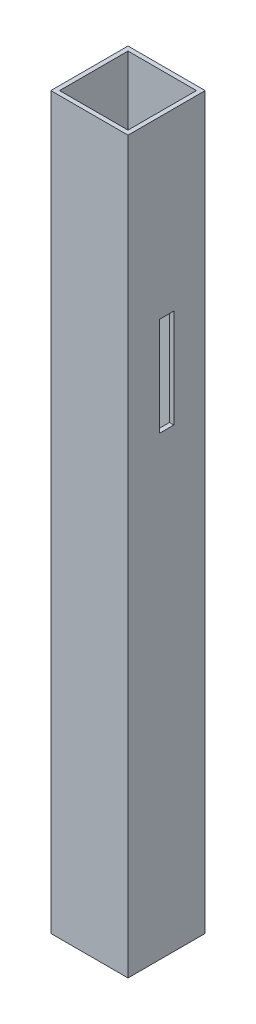
ISO-10303-21;
HEADER;
FILE_DESCRIPTION(('STEP AP214'),'2;1');
FILE_NAME('part.step','',(''),(''),'','','');
FILE_SCHEMA(('AUTOMOTIVE_DESIGN { 1 0 10303 214 1 1 1 1 }'));
ENDSEC;
DATA;
#1=APPLICATION_CONTEXT('core data for automotive mechanical design processes');
#2=APPLICATION_PROTOCOL_DEFINITION('international standard','automotive_design',2000,#1);
#3=PRODUCT_CONTEXT('',#1,'mechanical');
#4=PRODUCT('Part','Part','',(#3));
#5=PRODUCT_RELATED_PRODUCT_CATEGORY('part','',(#4));
#6=PRODUCT_DEFINITION_FORMATION('','',#4);
#7=PRODUCT_DEFINITION_CONTEXT('part definition',#1,'design');
#8=PRODUCT_DEFINITION('design','',#6,#7);
#9=PRODUCT_DEFINITION_SHAPE('','',#8);
#10=(LENGTH_UNIT() NAMED_UNIT(*) SI_UNIT(.MILLI.,.METRE.));
#11=(NAMED_UNIT(*) PLANE_ANGLE_UNIT() SI_UNIT($,.RADIAN.));
#12=(NAMED_UNIT(*) SI_UNIT($,.STERADIAN.) SOLID_ANGLE_UNIT());
#13=UNCERTAINTY_MEASURE_WITH_UNIT(LENGTH_MEASURE(1.E-05),#10,'distance_accuracy_value','');
#14=(GEOMETRIC_REPRESENTATION_CONTEXT(3) GLOBAL_UNCERTAINTY_ASSIGNED_CONTEXT((#13)) GLOBAL_UNIT_ASSIGNED_CONTEXT((#10,
#11,#12)) REPRESENTATION_CONTEXT('',''));
#15=CARTESIAN_POINT('',(0.,0.,0.));
#16=DIRECTION('',(0.,0.,1.));
#17=DIRECTION('',(1.,0.,0.));
#18=AXIS2_PLACEMENT_3D('',#15,#16,#17);
#19=CARTESIAN_POINT('',(0.,165.1,0.));
#20=DIRECTION('',(0.,1.,0.));
#21=DIRECTION('',(0.,0.,1.));
#22=AXIS2_PLACEMENT_3D('',#19,#20,#21);
#23=PLANE('',#22);
#24=DIRECTION('',(0.,0.,-1.));
#25=VECTOR('',#24,1.);
#26=CARTESIAN_POINT('',(17.4625,165.1,-17.4625));
#27=LINE('',#26,#25);
#28=CARTESIAN_POINT('',(17.4625,165.1,17.4625));
#29=VERTEX_POINT('',#28);
#30=CARTESIAN_POINT('',(17.4625,165.1,-17.4625));
#31=VERTEX_POINT('',#30);
#32=EDGE_CURVE('E235',#29,#31,#27,.T.);
#33=ORIENTED_EDGE('',*,*,#32,.T.);
#34=DIRECTION('',(-1.,0.,0.));
#35=VECTOR('',#34,1.);
#36=CARTESIAN_POINT('',(-17.4625,165.1,-17.4625));
#37=LINE('',#36,#35);
#38=CARTESIAN_POINT('',(-17.4625,165.1,-17.4625));
#39=VERTEX_POINT('',#38);
#40=EDGE_CURVE('E238',#31,#39,#37,.T.);
#41=ORIENTED_EDGE('',*,*,#40,.T.);
#42=DIRECTION('',(0.,0.,1.));
#43=VECTOR('',#42,1.);
#44=CARTESIAN_POINT('',(-17.4625,165.1,-17.4625));
#45=LINE('',#44,#43);
#46=CARTESIAN_POINT('',(-17.4625,165.1,17.4625));
#47=VERTEX_POINT('',#46);
#48=EDGE_CURVE('E241',#39,#47,#45,.T.);
#49=ORIENTED_EDGE('',*,*,#48,.T.);
#50=DIRECTION('',(1.,0.,0.));
#51=VECTOR('',#50,1.);
#52=CARTESIAN_POINT('',(-17.4625,165.1,17.4625));
#53=LINE('',#52,#51);
#54=EDGE_CURVE('E243',#47,#29,#53,.T.);
#55=ORIENTED_EDGE('',*,*,#54,.T.);
#56=EDGE_LOOP('',(#33,#41,#49,#55));
#57=FACE_BOUND('',#56,.T.);
#58=DIRECTION('',(-1.,0.,0.));
#59=VECTOR('',#58,1.);
#60=CARTESIAN_POINT('',(-15.4813,165.1,-15.4813));
#61=LINE('',#60,#59);
#62=CARTESIAN_POINT('',(15.4813,165.1,-15.4813));
#63=VERTEX_POINT('',#62);
#64=CARTESIAN_POINT('',(-15.4813,165.1,-15.4813));
#65=VERTEX_POINT('',#64);
#66=EDGE_CURVE('E206',#63,#65,#61,.T.);
#67=ORIENTED_EDGE('',*,*,#66,.F.);
#68=DIRECTION('',(0.,0.,-1.));
#69=VECTOR('',#68,1.);
#70=CARTESIAN_POINT('',(15.4813,165.1,15.4813));
#71=LINE('',#70,#69);
#72=CARTESIAN_POINT('',(15.4813,165.1,15.4813));
#73=VERTEX_POINT('',#72);
#74=EDGE_CURVE('E204',#73,#63,#71,.T.);
#75=ORIENTED_EDGE('',*,*,#74,.F.);
#76=DIRECTION('',(1.,0.,0.));
#77=VECTOR('',#76,1.);
#78=CARTESIAN_POINT('',(-15.4813,165.1,15.4813));
#79=LINE('',#78,#77);
#80=CARTESIAN_POINT('',(-15.4813,165.1,15.4813));
#81=VERTEX_POINT('',#80);
#82=EDGE_CURVE('E212',#81,#73,#79,.T.);
#83=ORIENTED_EDGE('',*,*,#82,.F.);
#84=DIRECTION('',(0.,0.,1.));
#85=VECTOR('',#84,1.);
#86=CARTESIAN_POINT('',(-15.4813,165.1,15.4813));
#87=LINE('',#86,#85);
#88=EDGE_CURVE('E209',#65,#81,#87,.T.);
#89=ORIENTED_EDGE('',*,*,#88,.F.);
#90=EDGE_LOOP('',(#67,#75,#83,#89));
#91=FACE_BOUND('',#90,.T.);
#92=ADVANCED_FACE('F35',(#57,#91),#23,.T.);
#93=CARTESIAN_POINT('',(0.,-165.1,0.));
#94=DIRECTION('',(0.,1.,0.));
#95=DIRECTION('',(0.,0.,1.));
#96=AXIS2_PLACEMENT_3D('',#93,#94,#95);
#97=PLANE('',#96);
#98=DIRECTION('',(0.,0.,-1.));
#99=VECTOR('',#98,1.);
#100=CARTESIAN_POINT('',(17.4625,-165.1,-17.4625));
#101=LINE('',#100,#99);
#102=CARTESIAN_POINT('',(17.4625,-165.1,17.4625));
#103=VERTEX_POINT('',#102);
#104=CARTESIAN_POINT('',(17.4625,-165.1,-17.4625));
#105=VERTEX_POINT('',#104);
#106=EDGE_CURVE('E234',#103,#105,#101,.T.);
#107=ORIENTED_EDGE('',*,*,#106,.F.);
#108=DIRECTION('',(1.,0.,0.));
#109=VECTOR('',#108,1.);
#110=CARTESIAN_POINT('',(-17.4625,-165.1,17.4625));
#111=LINE('',#110,#109);
#112=CARTESIAN_POINT('',(-17.4625,-165.1,17.4625));
#113=VERTEX_POINT('',#112);
#114=EDGE_CURVE('E239',#113,#103,#111,.T.);
#115=ORIENTED_EDGE('',*,*,#114,.F.);
#116=DIRECTION('',(0.,0.,1.));
#117=VECTOR('',#116,1.);
#118=CARTESIAN_POINT('',(-17.4625,-165.1,-17.4625));
#119=LINE('',#118,#117);
#120=CARTESIAN_POINT('',(-17.4625,-165.1,-17.4625));
#121=VERTEX_POINT('',#120);
#122=EDGE_CURVE('E250',#121,#113,#119,.T.);
#123=ORIENTED_EDGE('',*,*,#122,.F.);
#124=DIRECTION('',(-1.,0.,0.));
#125=VECTOR('',#124,1.);
#126=CARTESIAN_POINT('',(-17.4625,-165.1,-17.4625));
#127=LINE('',#126,#125);
#128=EDGE_CURVE('E248',#105,#121,#127,.T.);
#129=ORIENTED_EDGE('',*,*,#128,.F.);
#130=EDGE_LOOP('',(#107,#115,#123,#129));
#131=FACE_BOUND('',#130,.T.);
#132=DIRECTION('',(0.,0.,-1.));
#133=VECTOR('',#132,1.);
#134=CARTESIAN_POINT('',(15.4813,-165.1,15.4813));
#135=LINE('',#134,#133);
#136=CARTESIAN_POINT('',(15.4813,-165.1,15.4813));
#137=VERTEX_POINT('',#136);
#138=CARTESIAN_POINT('',(15.4813,-165.1,-15.4813));
#139=VERTEX_POINT('',#138);
#140=EDGE_CURVE('E203',#137,#139,#135,.T.);
#141=ORIENTED_EDGE('',*,*,#140,.T.);
#142=DIRECTION('',(-1.,0.,0.));
#143=VECTOR('',#142,1.);
#144=CARTESIAN_POINT('',(-15.4813,-165.1,-15.4813));
#145=LINE('',#144,#143);
#146=CARTESIAN_POINT('',(-15.4813,-165.1,-15.4813));
#147=VERTEX_POINT('',#146);
#148=EDGE_CURVE('E217',#139,#147,#145,.T.);
#149=ORIENTED_EDGE('',*,*,#148,.T.);
#150=DIRECTION('',(0.,0.,1.));
#151=VECTOR('',#150,1.);
#152=CARTESIAN_POINT('',(-15.4813,-165.1,15.4813));
#153=LINE('',#152,#151);
#154=CARTESIAN_POINT('',(-15.4813,-165.1,15.4813));
#155=VERTEX_POINT('',#154);
#156=EDGE_CURVE('E220',#147,#155,#153,.T.);
#157=ORIENTED_EDGE('',*,*,#156,.T.);
#158=DIRECTION('',(1.,0.,0.));
#159=VECTOR('',#158,1.);
#160=CARTESIAN_POINT('',(-15.4813,-165.1,15.4813));
#161=LINE('',#160,#159);
#162=EDGE_CURVE('E207',#155,#137,#161,.T.);
#163=ORIENTED_EDGE('',*,*,#162,.T.);
#164=EDGE_LOOP('',(#141,#149,#157,#163));
#165=FACE_BOUND('',#164,.T.);
#166=ADVANCED_FACE('F290',(#131,#165),#97,.F.);
#167=CARTESIAN_POINT('',(17.4625,165.1,-17.4625));
#168=DIRECTION('',(-1.,0.,0.));
#169=DIRECTION('',(0.,0.,1.));
#170=AXIS2_PLACEMENT_3D('',#167,#168,#169);
#171=PLANE('',#170);
#172=DIRECTION('',(0.,0.,1.));
#173=VECTOR('',#172,1.);
#174=CARTESIAN_POINT('',(17.4625,85.825000054,3.27500005400001));
#175=LINE('',#174,#173);
#176=CARTESIAN_POINT('',(17.4625,85.825000054,-3.275000054));
#177=VERTEX_POINT('',#176);
#178=CARTESIAN_POINT('',(17.4625,85.825000054,3.27500005400001));
#179=VERTEX_POINT('',#178);
#180=EDGE_CURVE('E181',#177,#179,#175,.T.);
#181=ORIENTED_EDGE('',*,*,#180,.F.);
#182=DIRECTION('',(0.,1.,0.));
#183=VECTOR('',#182,1.);
#184=CARTESIAN_POINT('',(17.4625,85.825000054,-3.27500005399999));
#185=LINE('',#184,#183);
#186=CARTESIAN_POINT('',(17.4625,41.174999946,-3.275000054));
#187=VERTEX_POINT('',#186);
#188=EDGE_CURVE('E50',#187,#177,#185,.T.);
#189=ORIENTED_EDGE('',*,*,#188,.F.);
#190=DIRECTION('',(0.,0.,-1.));
#191=VECTOR('',#190,1.);
#192=CARTESIAN_POINT('',(17.4625,41.174999946,3.275000054));
#193=LINE('',#192,#191);
#194=CARTESIAN_POINT('',(17.4625,41.174999946,3.275000054));
#195=VERTEX_POINT('',#194);
#196=EDGE_CURVE('E172',#195,#187,#193,.T.);
#197=ORIENTED_EDGE('',*,*,#196,.F.);
#198=DIRECTION('',(0.,-1.,0.));
#199=VECTOR('',#198,1.);
#200=CARTESIAN_POINT('',(17.4625,85.825000054,3.27500005400001));
#201=LINE('',#200,#199);
#202=EDGE_CURVE('E175',#179,#195,#201,.T.);
#203=ORIENTED_EDGE('',*,*,#202,.F.);
#204=EDGE_LOOP('',(#181,#189,#197,#203));
#205=FACE_BOUND('',#204,.T.);
#206=ORIENTED_EDGE('',*,*,#106,.T.);
#207=DIRECTION('',(0.,-1.,0.));
#208=VECTOR('',#207,1.);
#209=CARTESIAN_POINT('',(17.4625,165.1,-17.4625));
#210=LINE('',#209,#208);
#211=EDGE_CURVE('E261',#31,#105,#210,.T.);
#212=ORIENTED_EDGE('',*,*,#211,.F.);
#213=ORIENTED_EDGE('',*,*,#32,.F.);
#214=DIRECTION('',(0.,-1.,0.));
#215=VECTOR('',#214,1.);
#216=CARTESIAN_POINT('',(17.4625,165.1,17.4625));
#217=LINE('',#216,#215);
#218=EDGE_CURVE('E245',#29,#103,#217,.T.);
#219=ORIENTED_EDGE('',*,*,#218,.T.);
#220=EDGE_LOOP('',(#206,#212,#213,#219));
#221=FACE_BOUND('',#220,.T.);
#222=ADVANCED_FACE('F37',(#205,#221),#171,.F.);
#223=CARTESIAN_POINT('',(-17.4625,165.1,-17.4625));
#224=DIRECTION('',(0.,0.,1.));
#225=DIRECTION('',(1.,0.,0.));
#226=AXIS2_PLACEMENT_3D('',#223,#224,#225);
#227=PLANE('',#226);
#228=ORIENTED_EDGE('',*,*,#128,.T.);
#229=DIRECTION('',(0.,-1.,0.));
#230=VECTOR('',#229,1.);
#231=CARTESIAN_POINT('',(-17.4625,165.1,-17.4625));
#232=LINE('',#231,#230);
#233=EDGE_CURVE('E258',#39,#121,#232,.T.);
#234=ORIENTED_EDGE('',*,*,#233,.F.);
#235=ORIENTED_EDGE('',*,*,#40,.F.);
#236=ORIENTED_EDGE('',*,*,#211,.T.);
#237=EDGE_LOOP('',(#228,#234,#235,#236));
#238=FACE_BOUND('',#237,.T.);
#239=ADVANCED_FACE('F308',(#238),#227,.F.);
#240=CARTESIAN_POINT('',(-17.4625,165.1,-17.4625));
#241=DIRECTION('',(1.,0.,0.));
#242=DIRECTION('',(0.,0.,-1.));
#243=AXIS2_PLACEMENT_3D('',#240,#241,#242);
#244=PLANE('',#243);
#245=DIRECTION('',(0.,0.,-1.));
#246=VECTOR('',#245,1.);
#247=CARTESIAN_POINT('',(-17.4625,41.174999946,3.275000054));
#248=LINE('',#247,#246);
#249=CARTESIAN_POINT('',(-17.4625,41.174999946,3.275000054));
#250=VERTEX_POINT('',#249);
#251=CARTESIAN_POINT('',(-17.4625,41.174999946,-3.275000054));
#252=VERTEX_POINT('',#251);
#253=EDGE_CURVE('E171',#250,#252,#248,.T.);
#254=ORIENTED_EDGE('',*,*,#253,.T.);
#255=DIRECTION('',(0.,1.,0.));
#256=VECTOR('',#255,1.);
#257=CARTESIAN_POINT('',(-17.4625,85.825000054,-3.275000054));
#258=LINE('',#257,#256);
#259=CARTESIAN_POINT('',(-17.4625,85.825000054,-3.275000054));
#260=VERTEX_POINT('',#259);
#261=EDGE_CURVE('E154',#252,#260,#258,.T.);
#262=ORIENTED_EDGE('',*,*,#261,.T.);
#263=DIRECTION('',(0.,0.,1.));
#264=VECTOR('',#263,1.);
#265=CARTESIAN_POINT('',(-17.4625,85.825000054,3.275000054));
#266=LINE('',#265,#264);
#267=CARTESIAN_POINT('',(-17.4625,85.825000054,3.27500005400001));
#268=VERTEX_POINT('',#267);
#269=EDGE_CURVE('E163',#260,#268,#266,.T.);
#270=ORIENTED_EDGE('',*,*,#269,.T.);
#271=DIRECTION('',(0.,-1.,0.));
#272=VECTOR('',#271,1.);
#273=CARTESIAN_POINT('',(-17.4625,85.825000054,3.275000054));
#274=LINE('',#273,#272);
#275=EDGE_CURVE('E58',#268,#250,#274,.T.);
#276=ORIENTED_EDGE('',*,*,#275,.T.);
#277=EDGE_LOOP('',(#254,#262,#270,#276));
#278=FACE_BOUND('',#277,.T.);
#279=ORIENTED_EDGE('',*,*,#122,.T.);
#280=DIRECTION('',(0.,-1.,0.));
#281=VECTOR('',#280,1.);
#282=CARTESIAN_POINT('',(-17.4625,165.1,17.4625));
#283=LINE('',#282,#281);
#284=EDGE_CURVE('E255',#47,#113,#283,.T.);
#285=ORIENTED_EDGE('',*,*,#284,.F.);
#286=ORIENTED_EDGE('',*,*,#48,.F.);
#287=ORIENTED_EDGE('',*,*,#233,.T.);
#288=EDGE_LOOP('',(#279,#285,#286,#287));
#289=FACE_BOUND('',#288,.T.);
#290=ADVANCED_FACE('F168',(#278,#289),#244,.F.);
#291=CARTESIAN_POINT('',(-17.4625,165.1,17.4625));
#292=DIRECTION('',(0.,0.,-1.));
#293=DIRECTION('',(-1.,0.,0.));
#294=AXIS2_PLACEMENT_3D('',#291,#292,#293);
#295=PLANE('',#294);
#296=ORIENTED_EDGE('',*,*,#114,.T.);
#297=ORIENTED_EDGE('',*,*,#218,.F.);
#298=ORIENTED_EDGE('',*,*,#54,.F.);
#299=ORIENTED_EDGE('',*,*,#284,.T.);
#300=EDGE_LOOP('',(#296,#297,#298,#299));
#301=FACE_BOUND('',#300,.T.);
#302=ADVANCED_FACE('F303',(#301),#295,.F.);
#303=CARTESIAN_POINT('',(15.4813,165.1,15.4813));
#304=DIRECTION('',(-1.,0.,0.));
#305=DIRECTION('',(0.,0.,1.));
#306=AXIS2_PLACEMENT_3D('',#303,#304,#305);
#307=PLANE('',#306);
#308=DIRECTION('',(0.,-1.,0.));
#309=VECTOR('',#308,1.);
#310=CARTESIAN_POINT('',(15.4813,165.1,-3.27500005399998));
#311=LINE('',#310,#309);
#312=CARTESIAN_POINT('',(15.4813,85.825000054,-3.27500005399999));
#313=VERTEX_POINT('',#312);
#314=CARTESIAN_POINT('',(15.4813,41.174999946,-3.275000054));
#315=VERTEX_POINT('',#314);
#316=EDGE_CURVE('E201',#313,#315,#311,.T.);
#317=ORIENTED_EDGE('',*,*,#316,.F.);
#318=DIRECTION('',(0.,0.,-1.));
#319=VECTOR('',#318,1.);
#320=CARTESIAN_POINT('',(15.4813,85.825000054,15.4813000000002));
#321=LINE('',#320,#319);
#322=CARTESIAN_POINT('',(15.4813,85.825000054,3.27500005400001));
#323=VERTEX_POINT('',#322);
#324=EDGE_CURVE('E188',#323,#313,#321,.T.);
#325=ORIENTED_EDGE('',*,*,#324,.F.);
#326=DIRECTION('',(0.,1.,0.));
#327=VECTOR('',#326,1.);
#328=CARTESIAN_POINT('',(15.4813,165.1,3.27500005400002));
#329=LINE('',#328,#327);
#330=CARTESIAN_POINT('',(15.4813,41.174999946,3.275000054));
#331=VERTEX_POINT('',#330);
#332=EDGE_CURVE('E196',#331,#323,#329,.T.);
#333=ORIENTED_EDGE('',*,*,#332,.F.);
#334=DIRECTION('',(0.,0.,1.));
#335=VECTOR('',#334,1.);
#336=CARTESIAN_POINT('',(15.4813,41.174999946,15.4813));
#337=LINE('',#336,#335);
#338=EDGE_CURVE('E199',#315,#331,#337,.T.);
#339=ORIENTED_EDGE('',*,*,#338,.F.);
#340=EDGE_LOOP('',(#317,#325,#333,#339));
#341=FACE_BOUND('',#340,.T.);
#342=ORIENTED_EDGE('',*,*,#140,.F.);
#343=DIRECTION('',(0.,-1.,0.));
#344=VECTOR('',#343,1.);
#345=CARTESIAN_POINT('',(15.4813,165.1,15.4813));
#346=LINE('',#345,#344);
#347=EDGE_CURVE('E214',#73,#137,#346,.T.);
#348=ORIENTED_EDGE('',*,*,#347,.F.);
#349=ORIENTED_EDGE('',*,*,#74,.T.);
#350=DIRECTION('',(0.,-1.,0.));
#351=VECTOR('',#350,1.);
#352=CARTESIAN_POINT('',(15.4813,165.1,-15.4813));
#353=LINE('',#352,#351);
#354=EDGE_CURVE('E231',#63,#139,#353,.T.);
#355=ORIENTED_EDGE('',*,*,#354,.T.);
#356=EDGE_LOOP('',(#342,#348,#349,#355));
#357=FACE_BOUND('',#356,.T.);
#358=ADVANCED_FACE('F300',(#341,#357),#307,.T.);
#359=CARTESIAN_POINT('',(-15.4813,165.1,-15.4813));
#360=DIRECTION('',(0.,0.,1.));
#361=DIRECTION('',(1.,0.,0.));
#362=AXIS2_PLACEMENT_3D('',#359,#360,#361);
#363=PLANE('',#362);
#364=ORIENTED_EDGE('',*,*,#148,.F.);
#365=ORIENTED_EDGE('',*,*,#354,.F.);
#366=ORIENTED_EDGE('',*,*,#66,.T.);
#367=DIRECTION('',(0.,-1.,0.));
#368=VECTOR('',#367,1.);
#369=CARTESIAN_POINT('',(-15.4813,165.1,-15.4813));
#370=LINE('',#369,#368);
#371=EDGE_CURVE('E229',#65,#147,#370,.T.);
#372=ORIENTED_EDGE('',*,*,#371,.T.);
#373=EDGE_LOOP('',(#364,#365,#366,#372));
#374=FACE_BOUND('',#373,.T.);
#375=ADVANCED_FACE('F337',(#374),#363,.T.);
#376=CARTESIAN_POINT('',(-15.4813,165.1,15.4813));
#377=DIRECTION('',(1.,0.,0.));
#378=DIRECTION('',(0.,0.,-1.));
#379=AXIS2_PLACEMENT_3D('',#376,#377,#378);
#380=PLANE('',#379);
#381=DIRECTION('',(0.,1.,0.));
#382=VECTOR('',#381,1.);
#383=CARTESIAN_POINT('',(-15.4813,165.1,-3.27500005399999));
#384=LINE('',#383,#382);
#385=CARTESIAN_POINT('',(-15.4813,41.174999946,-3.275000054));
#386=VERTEX_POINT('',#385);
#387=CARTESIAN_POINT('',(-15.4813,85.825000054,-3.275000054));
#388=VERTEX_POINT('',#387);
#389=EDGE_CURVE('E11',#386,#388,#384,.T.);
#390=ORIENTED_EDGE('',*,*,#389,.F.);
#391=DIRECTION('',(0.,0.,-1.));
#392=VECTOR('',#391,1.);
#393=CARTESIAN_POINT('',(-15.4813,41.174999946,15.4813));
#394=LINE('',#393,#392);
#395=CARTESIAN_POINT('',(-15.4813,41.174999946,3.275000054));
#396=VERTEX_POINT('',#395);
#397=EDGE_CURVE('E43',#396,#386,#394,.T.);
#398=ORIENTED_EDGE('',*,*,#397,.F.);
#399=DIRECTION('',(0.,-1.,0.));
#400=VECTOR('',#399,1.);
#401=CARTESIAN_POINT('',(-15.4813,165.1,3.27500005400001));
#402=LINE('',#401,#400);
#403=CARTESIAN_POINT('',(-15.4813,85.825000054,3.275000054));
#404=VERTEX_POINT('',#403);
#405=EDGE_CURVE('E266',#404,#396,#402,.T.);
#406=ORIENTED_EDGE('',*,*,#405,.F.);
#407=DIRECTION('',(0.,0.,1.));
#408=VECTOR('',#407,1.);
#409=CARTESIAN_POINT('',(-15.4813,85.825000054,15.4813000000002));
#410=LINE('',#409,#408);
#411=EDGE_CURVE('E264',#388,#404,#410,.T.);
#412=ORIENTED_EDGE('',*,*,#411,.F.);
#413=EDGE_LOOP('',(#390,#398,#406,#412));
#414=FACE_BOUND('',#413,.T.);
#415=ORIENTED_EDGE('',*,*,#156,.F.);
#416=ORIENTED_EDGE('',*,*,#371,.F.);
#417=ORIENTED_EDGE('',*,*,#88,.T.);
#418=DIRECTION('',(0.,-1.,0.));
#419=VECTOR('',#418,1.);
#420=CARTESIAN_POINT('',(-15.4813,165.1,15.4813));
#421=LINE('',#420,#419);
#422=EDGE_CURVE('E227',#81,#155,#421,.T.);
#423=ORIENTED_EDGE('',*,*,#422,.T.);
#424=EDGE_LOOP('',(#415,#416,#417,#423));
#425=FACE_BOUND('',#424,.T.);
#426=ADVANCED_FACE('F272',(#414,#425),#380,.T.);
#427=CARTESIAN_POINT('',(-15.4813,165.1,15.4813));
#428=DIRECTION('',(0.,0.,-1.));
#429=DIRECTION('',(-1.,0.,0.));
#430=AXIS2_PLACEMENT_3D('',#427,#428,#429);
#431=PLANE('',#430);
#432=ORIENTED_EDGE('',*,*,#162,.F.);
#433=ORIENTED_EDGE('',*,*,#422,.F.);
#434=ORIENTED_EDGE('',*,*,#82,.T.);
#435=ORIENTED_EDGE('',*,*,#347,.T.);
#436=EDGE_LOOP('',(#432,#433,#434,#435));
#437=FACE_BOUND('',#436,.T.);
#438=ADVANCED_FACE('F284',(#437),#431,.T.);
#439=CARTESIAN_POINT('',(-17.4625,85.825000054,3.275000054));
#440=DIRECTION('',(0.,1.,0.));
#441=DIRECTION('',(0.,0.,1.));
#442=AXIS2_PLACEMENT_3D('',#439,#440,#441);
#443=PLANE('',#442);
#444=ORIENTED_EDGE('',*,*,#411,.T.);
#445=DIRECTION('',(1.,0.,0.));
#446=VECTOR('',#445,1.);
#447=CARTESIAN_POINT('',(-17.4625,85.825000054,3.275000054));
#448=LINE('',#447,#446);
#449=EDGE_CURVE('E165',#268,#404,#448,.T.);
#450=ORIENTED_EDGE('',*,*,#449,.F.);
#451=ORIENTED_EDGE('',*,*,#269,.F.);
#452=DIRECTION('',(1.,0.,0.));
#453=VECTOR('',#452,1.);
#454=CARTESIAN_POINT('',(-17.4625,85.825000054,-3.275000054));
#455=LINE('',#454,#453);
#456=EDGE_CURVE('E149',#260,#388,#455,.T.);
#457=ORIENTED_EDGE('',*,*,#456,.T.);
#458=EDGE_LOOP('',(#444,#450,#451,#457));
#459=FACE_BOUND('',#458,.T.);
#460=ADVANCED_FACE('F164',(#459),#443,.F.);
#461=CARTESIAN_POINT('',(-17.4625,85.825000054,3.275000054));
#462=DIRECTION('',(0.,0.,1.));
#463=DIRECTION('',(1.,0.,0.));
#464=AXIS2_PLACEMENT_3D('',#461,#462,#463);
#465=PLANE('',#464);
#466=ORIENTED_EDGE('',*,*,#405,.T.);
#467=DIRECTION('',(1.,0.,0.));
#468=VECTOR('',#467,1.);
#469=CARTESIAN_POINT('',(-17.4625,41.174999946,3.275000054));
#470=LINE('',#469,#468);
#471=EDGE_CURVE('E190',#250,#396,#470,.T.);
#472=ORIENTED_EDGE('',*,*,#471,.F.);
#473=ORIENTED_EDGE('',*,*,#275,.F.);
#474=ORIENTED_EDGE('',*,*,#449,.T.);
#475=EDGE_LOOP('',(#466,#472,#473,#474));
#476=FACE_BOUND('',#475,.T.);
#477=ADVANCED_FACE('F274',(#476),#465,.F.);
#478=CARTESIAN_POINT('',(-17.4625,41.174999946,3.275000054));
#479=DIRECTION('',(0.,-1.,0.));
#480=DIRECTION('',(0.,0.,-1.));
#481=AXIS2_PLACEMENT_3D('',#478,#479,#480);
#482=PLANE('',#481);
#483=ORIENTED_EDGE('',*,*,#397,.T.);
#484=DIRECTION('',(1.,0.,0.));
#485=VECTOR('',#484,1.);
#486=CARTESIAN_POINT('',(-17.4625,41.174999946,-3.275000054));
#487=LINE('',#486,#485);
#488=EDGE_CURVE('E186',#252,#386,#487,.T.);
#489=ORIENTED_EDGE('',*,*,#488,.F.);
#490=ORIENTED_EDGE('',*,*,#253,.F.);
#491=ORIENTED_EDGE('',*,*,#471,.T.);
#492=EDGE_LOOP('',(#483,#489,#490,#491));
#493=FACE_BOUND('',#492,.T.);
#494=ADVANCED_FACE('F269',(#493),#482,.F.);
#495=CARTESIAN_POINT('',(-17.4625,85.825000054,-3.275000054));
#496=DIRECTION('',(0.,0.,-1.));
#497=DIRECTION('',(-1.,0.,0.));
#498=AXIS2_PLACEMENT_3D('',#495,#496,#497);
#499=PLANE('',#498);
#500=ORIENTED_EDGE('',*,*,#389,.T.);
#501=ORIENTED_EDGE('',*,*,#456,.F.);
#502=ORIENTED_EDGE('',*,*,#261,.F.);
#503=ORIENTED_EDGE('',*,*,#488,.T.);
#504=EDGE_LOOP('',(#500,#501,#502,#503));
#505=FACE_BOUND('',#504,.T.);
#506=ADVANCED_FACE('F151',(#505),#499,.F.);
#507=ORIENTED_EDGE('',*,*,#316,.T.);
#508=EDGE_CURVE('E189',#315,#187,#487,.T.);
#509=ORIENTED_EDGE('',*,*,#508,.T.);
#510=ORIENTED_EDGE('',*,*,#188,.T.);
#511=EDGE_CURVE('E160',#313,#177,#455,.T.);
#512=ORIENTED_EDGE('',*,*,#511,.F.);
#513=EDGE_LOOP('',(#507,#509,#510,#512));
#514=FACE_BOUND('',#513,.T.);
#515=ADVANCED_FACE('F349',(#514),#499,.F.);
#516=ORIENTED_EDGE('',*,*,#338,.T.);
#517=EDGE_CURVE('E193',#331,#195,#470,.T.);
#518=ORIENTED_EDGE('',*,*,#517,.T.);
#519=ORIENTED_EDGE('',*,*,#196,.T.);
#520=ORIENTED_EDGE('',*,*,#508,.F.);
#521=EDGE_LOOP('',(#516,#518,#519,#520));
#522=FACE_BOUND('',#521,.T.);
#523=ADVANCED_FACE('F283',(#522),#482,.F.);
#524=ORIENTED_EDGE('',*,*,#332,.T.);
#525=EDGE_CURVE('E159',#323,#179,#448,.T.);
#526=ORIENTED_EDGE('',*,*,#525,.T.);
#527=ORIENTED_EDGE('',*,*,#202,.T.);
#528=ORIENTED_EDGE('',*,*,#517,.F.);
#529=EDGE_LOOP('',(#524,#526,#527,#528));
#530=FACE_BOUND('',#529,.T.);
#531=ADVANCED_FACE('F277',(#530),#465,.F.);
#532=ORIENTED_EDGE('',*,*,#324,.T.);
#533=ORIENTED_EDGE('',*,*,#511,.T.);
#534=ORIENTED_EDGE('',*,*,#180,.T.);
#535=ORIENTED_EDGE('',*,*,#525,.F.);
#536=EDGE_LOOP('',(#532,#533,#534,#535));
#537=FACE_BOUND('',#536,.T.);
#538=ADVANCED_FACE('F286',(#537),#443,.F.);
#539=CLOSED_SHELL('',(#92,#166,#222,#239,#290,#302,#358,#375,#426,#438,#460,#477,#494,#506,#515,
#523,#531,#538));
#540=MANIFOLD_SOLID_BREP('B2',#539);
#541=ADVANCED_BREP_SHAPE_REPRESENTATION('',(#18,#540),#14);
#542=SHAPE_DEFINITION_REPRESENTATION(#9,#541);
ENDSEC;
END-ISO-10303-21;
